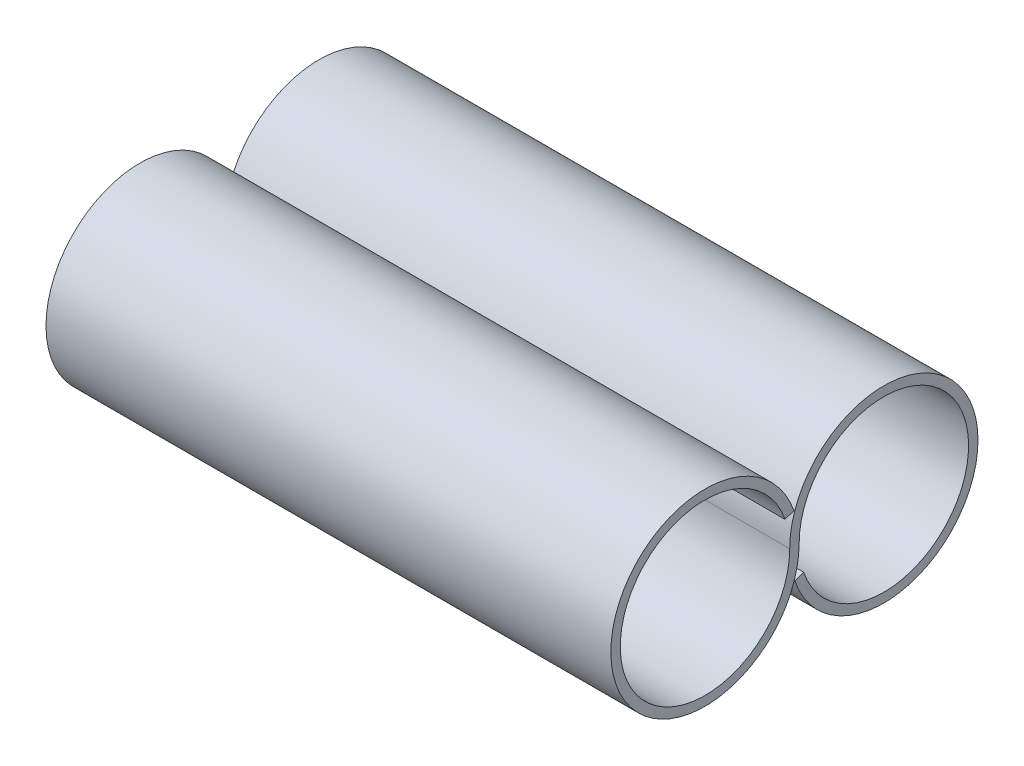
ISO-10303-21;
HEADER;
FILE_DESCRIPTION(('STEP AP214'),'2;1');
FILE_NAME('part.step','',(''),(''),'','','');
FILE_SCHEMA(('AUTOMOTIVE_DESIGN { 1 0 10303 214 1 1 1 1 }'));
ENDSEC;
DATA;
#1=APPLICATION_CONTEXT('core data for automotive mechanical design processes');
#2=APPLICATION_PROTOCOL_DEFINITION('international standard','automotive_design',2000,#1);
#3=PRODUCT_CONTEXT('',#1,'mechanical');
#4=PRODUCT('Part','Part','',(#3));
#5=PRODUCT_RELATED_PRODUCT_CATEGORY('part','',(#4));
#6=PRODUCT_DEFINITION_FORMATION('','',#4);
#7=PRODUCT_DEFINITION_CONTEXT('part definition',#1,'design');
#8=PRODUCT_DEFINITION('design','',#6,#7);
#9=PRODUCT_DEFINITION_SHAPE('','',#8);
#10=(LENGTH_UNIT() NAMED_UNIT(*) SI_UNIT(.MILLI.,.METRE.));
#11=(NAMED_UNIT(*) PLANE_ANGLE_UNIT() SI_UNIT($,.RADIAN.));
#12=(NAMED_UNIT(*) SI_UNIT($,.STERADIAN.) SOLID_ANGLE_UNIT());
#13=UNCERTAINTY_MEASURE_WITH_UNIT(LENGTH_MEASURE(1.E-05),#10,'distance_accuracy_value','');
#14=(GEOMETRIC_REPRESENTATION_CONTEXT(3) GLOBAL_UNCERTAINTY_ASSIGNED_CONTEXT((#13)) GLOBAL_UNIT_ASSIGNED_CONTEXT((#10,
#11,#12)) REPRESENTATION_CONTEXT('',''));
#15=CARTESIAN_POINT('',(0.,0.,0.));
#16=DIRECTION('',(0.,0.,1.));
#17=DIRECTION('',(1.,0.,0.));
#18=AXIS2_PLACEMENT_3D('',#15,#16,#17);
#19=CARTESIAN_POINT('',(60.,0.392186660055,8.70688125529225));
#20=DIRECTION('',(-1.,0.,0.));
#21=DIRECTION('',(0.,0.,1.));
#22=AXIS2_PLACEMENT_3D('',#19,#20,#21);
#23=CYLINDRICAL_SURFACE('',#22,10.);
#24=CARTESIAN_POINT('',(0.,0.392186660055,8.70688125529225));
#25=DIRECTION('',(1.,0.,0.));
#26=DIRECTION('',(0.,0.,1.));
#27=AXIS2_PLACEMENT_3D('',#24,#25,#26);
#28=CIRCLE('',#27,10.);
#29=CARTESIAN_POINT('',(0.,3.67378114020056,-0.739342205323013));
#30=VERTEX_POINT('',#29);
#31=CARTESIAN_POINT('',(0.,0.392186660055001,-1.29311874470775));
#32=VERTEX_POINT('',#31);
#33=EDGE_CURVE('E118',#30,#32,#28,.T.);
#34=ORIENTED_EDGE('',*,*,#33,.T.);
#35=DIRECTION('',(-1.,0.,0.));
#36=VECTOR('',#35,1.);
#37=CARTESIAN_POINT('',(60.,0.392186660055001,-1.29311874470775));
#38=LINE('',#37,#36);
#39=CARTESIAN_POINT('',(60.,0.392186660055001,-1.29311874470775));
#40=VERTEX_POINT('',#39);
#41=EDGE_CURVE('E11',#40,#32,#38,.T.);
#42=ORIENTED_EDGE('',*,*,#41,.F.);
#43=CARTESIAN_POINT('',(60.,0.392186660055,8.70688125529225));
#44=DIRECTION('',(1.,0.,0.));
#45=DIRECTION('',(0.,0.,1.));
#46=AXIS2_PLACEMENT_3D('',#43,#44,#45);
#47=CIRCLE('',#46,10.);
#48=CARTESIAN_POINT('',(60.,3.67378114020056,-0.739342205323013));
#49=VERTEX_POINT('',#48);
#50=EDGE_CURVE('E128',#49,#40,#47,.T.);
#51=ORIENTED_EDGE('',*,*,#50,.F.);
#52=DIRECTION('',(-1.,0.,0.));
#53=VECTOR('',#52,1.);
#54=CARTESIAN_POINT('',(60.,3.67378114020056,-0.739342205323013));
#55=LINE('',#54,#53);
#56=EDGE_CURVE('E114',#49,#30,#55,.T.);
#57=ORIENTED_EDGE('',*,*,#56,.T.);
#58=EDGE_LOOP('',(#34,#42,#51,#57));
#59=FACE_BOUND('',#58,.T.);
#60=ADVANCED_FACE('F34',(#59),#23,.T.);
#61=CARTESIAN_POINT('',(60.,0.392186660055,-10.2931187447078));
#62=DIRECTION('',(-1.,0.,0.));
#63=DIRECTION('',(0.,0.,1.));
#64=AXIS2_PLACEMENT_3D('',#61,#62,#63);
#65=CYLINDRICAL_SURFACE('',#64,9.);
#66=CARTESIAN_POINT('',(0.,0.392186660055,-10.2931187447078));
#67=DIRECTION('',(-1.,0.,0.));
#68=DIRECTION('',(0.,0.,-1.));
#69=AXIS2_PLACEMENT_3D('',#66,#67,#68);
#70=CIRCLE('',#69,9.);
#71=CARTESIAN_POINT('',(0.,-2.49874613034636,-1.77006133545711));
#72=VERTEX_POINT('',#71);
#73=EDGE_CURVE('E121',#32,#72,#70,.T.);
#74=ORIENTED_EDGE('',*,*,#73,.T.);
#75=DIRECTION('',(-1.,0.,0.));
#76=VECTOR('',#75,1.);
#77=CARTESIAN_POINT('',(60.,-2.49874613034636,-1.77006133545711));
#78=LINE('',#77,#76);
#79=CARTESIAN_POINT('',(60.,-2.49874613034636,-1.77006133545711));
#80=VERTEX_POINT('',#79);
#81=EDGE_CURVE('E42',#80,#72,#78,.T.);
#82=ORIENTED_EDGE('',*,*,#81,.F.);
#83=CARTESIAN_POINT('',(60.,0.392186660055,-10.2931187447078));
#84=DIRECTION('',(-1.,0.,0.));
#85=DIRECTION('',(0.,0.,-1.));
#86=AXIS2_PLACEMENT_3D('',#83,#84,#85);
#87=CIRCLE('',#86,9.);
#88=EDGE_CURVE('E87',#40,#80,#87,.T.);
#89=ORIENTED_EDGE('',*,*,#88,.F.);
#90=ORIENTED_EDGE('',*,*,#41,.T.);
#91=EDGE_LOOP('',(#74,#82,#89,#90));
#92=FACE_BOUND('',#91,.T.);
#93=ADVANCED_FACE('F152',(#92),#65,.F.);
#94=CARTESIAN_POINT('',(60.,-2.8199608848354,-0.823054956651485));
#95=DIRECTION('',(0.,-0.947006378805626,-0.321214754489041));
#96=DIRECTION('',(0.,0.321214754489041,-0.947006378805626));
#97=AXIS2_PLACEMENT_3D('',#94,#95,#96);
#98=PLANE('',#97);
#99=DIRECTION('',(0.,-0.321214754489041,0.947006378805626));
#100=VECTOR('',#99,1.);
#101=CARTESIAN_POINT('',(0.,-2.8199608848354,-0.823054956651485));
#102=LINE('',#101,#100);
#103=CARTESIAN_POINT('',(0.,-2.81996088483541,-0.823054956651487));
#104=VERTEX_POINT('',#103);
#105=EDGE_CURVE('E123',#72,#104,#102,.T.);
#106=ORIENTED_EDGE('',*,*,#105,.T.);
#107=DIRECTION('',(-1.,0.,0.));
#108=VECTOR('',#107,1.);
#109=CARTESIAN_POINT('',(60.,-2.81996088483541,-0.823054956651487));
#110=LINE('',#109,#108);
#111=CARTESIAN_POINT('',(60.,-2.81996088483541,-0.823054956651487));
#112=VERTEX_POINT('',#111);
#113=EDGE_CURVE('E109',#112,#104,#110,.T.);
#114=ORIENTED_EDGE('',*,*,#113,.F.);
#115=DIRECTION('',(0.,-0.321214754489041,0.947006378805626));
#116=VECTOR('',#115,1.);
#117=CARTESIAN_POINT('',(60.,-2.8199608848354,-0.823054956651485));
#118=LINE('',#117,#116);
#119=EDGE_CURVE('E100',#80,#112,#118,.T.);
#120=ORIENTED_EDGE('',*,*,#119,.F.);
#121=ORIENTED_EDGE('',*,*,#81,.T.);
#122=EDGE_LOOP('',(#106,#114,#120,#121));
#123=FACE_BOUND('',#122,.T.);
#124=ADVANCED_FACE('F134',(#123),#98,.F.);
#125=CARTESIAN_POINT('',(60.,0.392186660055,-10.2931187447078));
#126=DIRECTION('',(-1.,0.,0.));
#127=DIRECTION('',(0.,0.,1.));
#128=AXIS2_PLACEMENT_3D('',#125,#126,#127);
#129=CYLINDRICAL_SURFACE('',#128,10.);
#130=CARTESIAN_POINT('',(0.,0.392186660055,-10.2931187447078));
#131=DIRECTION('',(1.,0.,0.));
#132=DIRECTION('',(0.,0.,1.));
#133=AXIS2_PLACEMENT_3D('',#130,#131,#132);
#134=CIRCLE('',#133,10.);
#135=CARTESIAN_POINT('',(0.,0.392186660054999,-0.293118744707751));
#136=VERTEX_POINT('',#135);
#137=EDGE_CURVE('E108',#104,#136,#134,.T.);
#138=ORIENTED_EDGE('',*,*,#137,.T.);
#139=DIRECTION('',(-1.,0.,0.));
#140=VECTOR('',#139,1.);
#141=CARTESIAN_POINT('',(60.,0.392186660054999,-0.293118744707751));
#142=LINE('',#141,#140);
#143=CARTESIAN_POINT('',(60.,0.392186660054999,-0.293118744707751));
#144=VERTEX_POINT('',#143);
#145=EDGE_CURVE('E105',#144,#136,#142,.T.);
#146=ORIENTED_EDGE('',*,*,#145,.F.);
#147=CARTESIAN_POINT('',(60.,0.392186660055,-10.2931187447078));
#148=DIRECTION('',(1.,0.,0.));
#149=DIRECTION('',(0.,0.,1.));
#150=AXIS2_PLACEMENT_3D('',#147,#148,#149);
#151=CIRCLE('',#150,10.);
#152=EDGE_CURVE('E94',#112,#144,#151,.T.);
#153=ORIENTED_EDGE('',*,*,#152,.F.);
#154=ORIENTED_EDGE('',*,*,#113,.T.);
#155=EDGE_LOOP('',(#138,#146,#153,#154));
#156=FACE_BOUND('',#155,.T.);
#157=ADVANCED_FACE('F106',(#156),#129,.T.);
#158=CARTESIAN_POINT('',(60.,0.392186660054999,8.70688125529225));
#159=DIRECTION('',(-1.,0.,0.));
#160=DIRECTION('',(0.,0.,1.));
#161=AXIS2_PLACEMENT_3D('',#158,#159,#160);
#162=CYLINDRICAL_SURFACE('',#161,9.);
#163=CARTESIAN_POINT('',(0.,0.392186660054999,8.70688125529225));
#164=DIRECTION('',(-1.,0.,0.));
#165=DIRECTION('',(0.,0.,-1.));
#166=AXIS2_PLACEMENT_3D('',#163,#164,#165);
#167=CIRCLE('',#166,9.);
#168=CARTESIAN_POINT('',(0.,3.345621692186,0.205280140738513));
#169=VERTEX_POINT('',#168);
#170=EDGE_CURVE('E73',#136,#169,#167,.T.);
#171=ORIENTED_EDGE('',*,*,#170,.T.);
#172=DIRECTION('',(-1.,0.,0.));
#173=VECTOR('',#172,1.);
#174=CARTESIAN_POINT('',(60.,3.345621692186,0.205280140738513));
#175=LINE('',#174,#173);
#176=CARTESIAN_POINT('',(60.,3.345621692186,0.205280140738513));
#177=VERTEX_POINT('',#176);
#178=EDGE_CURVE('E110',#177,#169,#175,.T.);
#179=ORIENTED_EDGE('',*,*,#178,.F.);
#180=CARTESIAN_POINT('',(60.,0.392186660054999,8.70688125529225));
#181=DIRECTION('',(-1.,0.,0.));
#182=DIRECTION('',(0.,0.,-1.));
#183=AXIS2_PLACEMENT_3D('',#180,#181,#182);
#184=CIRCLE('',#183,9.);
#185=EDGE_CURVE('E98',#144,#177,#184,.T.);
#186=ORIENTED_EDGE('',*,*,#185,.F.);
#187=ORIENTED_EDGE('',*,*,#145,.T.);
#188=EDGE_LOOP('',(#171,#179,#186,#187));
#189=FACE_BOUND('',#188,.T.);
#190=ADVANCED_FACE('F112',(#189),#162,.F.);
#191=CARTESIAN_POINT('',(60.,3.67378114020056,-0.739342205323013));
#192=DIRECTION('',(0.,0.944622346061526,0.328159448014557));
#193=DIRECTION('',(0.,-0.328159448014557,0.944622346061526));
#194=AXIS2_PLACEMENT_3D('',#191,#192,#193);
#195=PLANE('',#194);
#196=DIRECTION('',(0.,0.328159448014556,-0.944622346061526));
#197=VECTOR('',#196,1.);
#198=CARTESIAN_POINT('',(0.,3.67378114020056,-0.739342205323013));
#199=LINE('',#198,#197);
#200=EDGE_CURVE('E79',#169,#30,#199,.T.);
#201=ORIENTED_EDGE('',*,*,#200,.T.);
#202=ORIENTED_EDGE('',*,*,#56,.F.);
#203=DIRECTION('',(0.,0.328159448014556,-0.944622346061526));
#204=VECTOR('',#203,1.);
#205=CARTESIAN_POINT('',(60.,3.67378114020056,-0.739342205323013));
#206=LINE('',#205,#204);
#207=EDGE_CURVE('E50',#177,#49,#206,.T.);
#208=ORIENTED_EDGE('',*,*,#207,.F.);
#209=ORIENTED_EDGE('',*,*,#178,.T.);
#210=EDGE_LOOP('',(#201,#202,#208,#209));
#211=FACE_BOUND('',#210,.T.);
#212=ADVANCED_FACE('F141',(#211),#195,.F.);
#213=CARTESIAN_POINT('',(60.,0.392186660055,8.70688125529225));
#214=DIRECTION('',(-1.,0.,0.));
#215=DIRECTION('',(0.,0.,1.));
#216=AXIS2_PLACEMENT_3D('',#213,#214,#215);
#217=PLANE('',#216);
#218=ORIENTED_EDGE('',*,*,#50,.T.);
#219=ORIENTED_EDGE('',*,*,#88,.T.);
#220=ORIENTED_EDGE('',*,*,#119,.T.);
#221=ORIENTED_EDGE('',*,*,#152,.T.);
#222=ORIENTED_EDGE('',*,*,#185,.T.);
#223=ORIENTED_EDGE('',*,*,#207,.T.);
#224=EDGE_LOOP('',(#218,#219,#220,#221,#222,#223));
#225=FACE_BOUND('',#224,.T.);
#226=ADVANCED_FACE('F96',(#225),#217,.F.);
#227=CARTESIAN_POINT('',(0.,0.392186660055,8.70688125529225));
#228=DIRECTION('',(-1.,0.,0.));
#229=DIRECTION('',(0.,0.,1.));
#230=AXIS2_PLACEMENT_3D('',#227,#228,#229);
#231=PLANE('',#230);
#232=ORIENTED_EDGE('',*,*,#33,.F.);
#233=ORIENTED_EDGE('',*,*,#200,.F.);
#234=ORIENTED_EDGE('',*,*,#170,.F.);
#235=ORIENTED_EDGE('',*,*,#137,.F.);
#236=ORIENTED_EDGE('',*,*,#105,.F.);
#237=ORIENTED_EDGE('',*,*,#73,.F.);
#238=EDGE_LOOP('',(#232,#233,#234,#235,#236,#237));
#239=FACE_BOUND('',#238,.T.);
#240=ADVANCED_FACE('F137',(#239),#231,.T.);
#241=CLOSED_SHELL('',(#60,#93,#124,#157,#190,#212,#226,#240));
#242=MANIFOLD_SOLID_BREP('B2',#241);
#243=ADVANCED_BREP_SHAPE_REPRESENTATION('',(#18,#242),#14);
#244=SHAPE_DEFINITION_REPRESENTATION(#9,#243);
ENDSEC;
END-ISO-10303-21;
